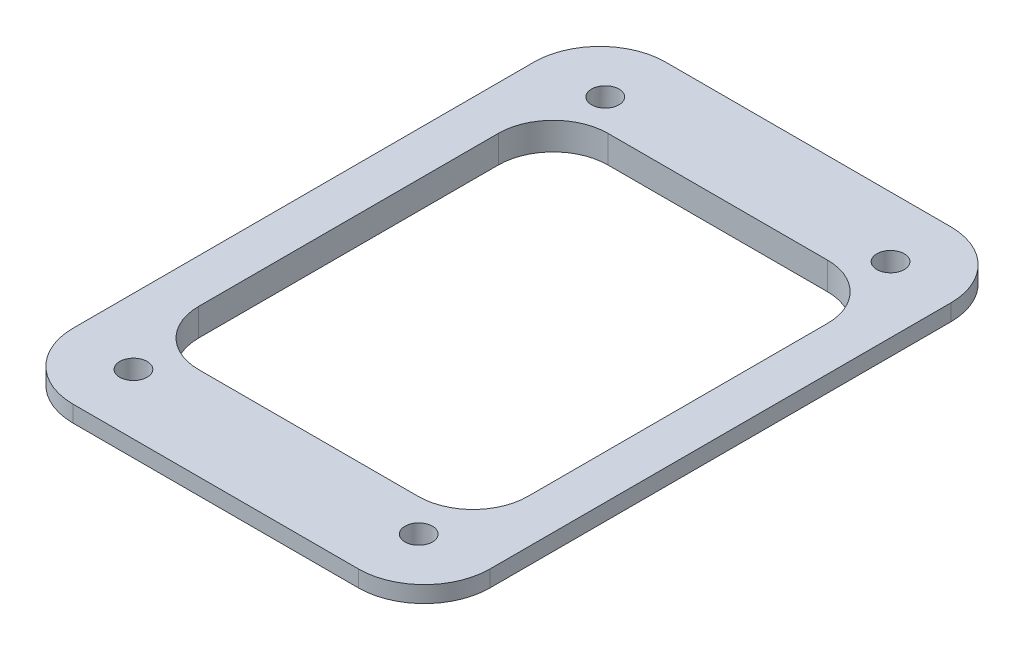
ISO-10303-21;
HEADER;
FILE_DESCRIPTION(('STEP AP214'),'2;1');
FILE_NAME('part.step','',(''),(''),'','','');
FILE_SCHEMA(('AUTOMOTIVE_DESIGN { 1 0 10303 214 1 1 1 1 }'));
ENDSEC;
DATA;
#1=APPLICATION_CONTEXT('core data for automotive mechanical design processes');
#2=APPLICATION_PROTOCOL_DEFINITION('international standard','automotive_design',2000,#1);
#3=PRODUCT_CONTEXT('',#1,'mechanical');
#4=PRODUCT('Part','Part','',(#3));
#5=PRODUCT_RELATED_PRODUCT_CATEGORY('part','',(#4));
#6=PRODUCT_DEFINITION_FORMATION('','',#4);
#7=PRODUCT_DEFINITION_CONTEXT('part definition',#1,'design');
#8=PRODUCT_DEFINITION('design','',#6,#7);
#9=PRODUCT_DEFINITION_SHAPE('','',#8);
#10=(LENGTH_UNIT() NAMED_UNIT(*) SI_UNIT(.MILLI.,.METRE.));
#11=(NAMED_UNIT(*) PLANE_ANGLE_UNIT() SI_UNIT($,.RADIAN.));
#12=(NAMED_UNIT(*) SI_UNIT($,.STERADIAN.) SOLID_ANGLE_UNIT());
#13=UNCERTAINTY_MEASURE_WITH_UNIT(LENGTH_MEASURE(1.E-05),#10,'distance_accuracy_value','');
#14=(GEOMETRIC_REPRESENTATION_CONTEXT(3) GLOBAL_UNCERTAINTY_ASSIGNED_CONTEXT((#13)) GLOBAL_UNIT_ASSIGNED_CONTEXT((#10,
#11,#12)) REPRESENTATION_CONTEXT('',''));
#15=CARTESIAN_POINT('',(0.,0.,0.));
#16=DIRECTION('',(0.,0.,1.));
#17=DIRECTION('',(1.,0.,0.));
#18=AXIS2_PLACEMENT_3D('',#15,#16,#17);
#19=CARTESIAN_POINT('',(-31.,0.,-3.));
#20=DIRECTION('',(0.,-1.,0.));
#21=DIRECTION('',(0.,0.,-1.));
#22=AXIS2_PLACEMENT_3D('',#19,#20,#21);
#23=PLANE('',#22);
#24=CARTESIAN_POINT('',(-30.,0.,-3.49999999999999));
#25=DIRECTION('',(0.,-1.,0.));
#26=DIRECTION('',(0.,0.,-1.));
#27=AXIS2_PLACEMENT_3D('',#24,#25,#26);
#28=CIRCLE('',#27,1.25);
#29=CARTESIAN_POINT('',(-30.,0.,-4.74999999999999));
#30=VERTEX_POINT('',#29);
#31=EDGE_CURVE('E249',#30,#30,#28,.T.);
#32=ORIENTED_EDGE('',*,*,#31,.F.);
#33=EDGE_LOOP('',(#32));
#34=FACE_BOUND('',#33,.T.);
#35=CARTESIAN_POINT('',(-3.99999999999999,0.,-3.5));
#36=DIRECTION('',(0.,-1.,0.));
#37=DIRECTION('',(0.,0.,-1.));
#38=AXIS2_PLACEMENT_3D('',#35,#36,#37);
#39=CIRCLE('',#38,1.25);
#40=CARTESIAN_POINT('',(-3.99999999999999,0.,-4.75));
#41=VERTEX_POINT('',#40);
#42=EDGE_CURVE('E626',#41,#41,#39,.T.);
#43=ORIENTED_EDGE('',*,*,#42,.F.);
#44=EDGE_LOOP('',(#43));
#45=FACE_BOUND('',#44,.T.);
#46=CARTESIAN_POINT('',(-4.,0.,-46.5));
#47=DIRECTION('',(0.,-1.,0.));
#48=DIRECTION('',(0.,0.,-1.));
#49=AXIS2_PLACEMENT_3D('',#46,#47,#48);
#50=CIRCLE('',#49,1.25);
#51=CARTESIAN_POINT('',(-4.,0.,-47.75));
#52=VERTEX_POINT('',#51);
#53=EDGE_CURVE('E607',#52,#52,#50,.T.);
#54=ORIENTED_EDGE('',*,*,#53,.F.);
#55=EDGE_LOOP('',(#54));
#56=FACE_BOUND('',#55,.T.);
#57=CARTESIAN_POINT('',(-30.,0.,-46.5));
#58=DIRECTION('',(0.,-1.,0.));
#59=DIRECTION('',(0.,0.,-1.));
#60=AXIS2_PLACEMENT_3D('',#57,#58,#59);
#61=CIRCLE('',#60,1.25);
#62=CARTESIAN_POINT('',(-30.,0.,-47.75));
#63=VERTEX_POINT('',#62);
#64=EDGE_CURVE('E616',#63,#63,#61,.T.);
#65=ORIENTED_EDGE('',*,*,#64,.F.);
#66=EDGE_LOOP('',(#65));
#67=FACE_BOUND('',#66,.T.);
#68=DIRECTION('',(0.,0.,-1.));
#69=VECTOR('',#68,1.);
#70=CARTESIAN_POINT('',(-27.165,0.,-45.83));
#71=LINE('',#70,#69);
#72=CARTESIAN_POINT('',(-27.165,0.,-45.83));
#73=VERTEX_POINT('',#72);
#74=CARTESIAN_POINT('',(-27.165,0.,-48.37));
#75=VERTEX_POINT('',#74);
#76=EDGE_CURVE('E52',#73,#75,#71,.T.);
#77=ORIENTED_EDGE('',*,*,#76,.F.);
#78=DIRECTION('',(-1.,0.,0.));
#79=VECTOR('',#78,1.);
#80=CARTESIAN_POINT('',(-27.165,0.,-45.83));
#81=LINE('',#80,#79);
#82=CARTESIAN_POINT('',(-6.825,0.,-45.83));
#83=VERTEX_POINT('',#82);
#84=EDGE_CURVE('E243',#83,#73,#81,.T.);
#85=ORIENTED_EDGE('',*,*,#84,.F.);
#86=DIRECTION('',(0.,0.,1.));
#87=VECTOR('',#86,1.);
#88=CARTESIAN_POINT('',(-6.825,0.,-45.83));
#89=LINE('',#88,#87);
#90=CARTESIAN_POINT('',(-6.825,0.,-48.37));
#91=VERTEX_POINT('',#90);
#92=EDGE_CURVE('E246',#91,#83,#89,.T.);
#93=ORIENTED_EDGE('',*,*,#92,.F.);
#94=DIRECTION('',(1.,0.,0.));
#95=VECTOR('',#94,1.);
#96=CARTESIAN_POINT('',(-27.165,0.,-48.37));
#97=LINE('',#96,#95);
#98=EDGE_CURVE('E255',#75,#91,#97,.T.);
#99=ORIENTED_EDGE('',*,*,#98,.F.);
#100=EDGE_LOOP('',(#77,#85,#93,#99));
#101=FACE_BOUND('',#100,.T.);
#102=CARTESIAN_POINT('',(-31.,0.,-3.));
#103=DIRECTION('',(0.,1.,0.));
#104=DIRECTION('',(0.,0.,-1.));
#105=AXIS2_PLACEMENT_3D('',#102,#103,#104);
#106=CIRCLE('',#105,3.);
#107=CARTESIAN_POINT('',(-34.,0.,-3.));
#108=VERTEX_POINT('',#107);
#109=CARTESIAN_POINT('',(-31.,0.,0.));
#110=VERTEX_POINT('',#109);
#111=EDGE_CURVE('E384',#108,#110,#106,.T.);
#112=ORIENTED_EDGE('',*,*,#111,.F.);
#113=DIRECTION('',(0.,0.,1.));
#114=VECTOR('',#113,1.);
#115=CARTESIAN_POINT('',(-34.,0.,-3.));
#116=LINE('',#115,#114);
#117=CARTESIAN_POINT('',(-34.,0.,-47.));
#118=VERTEX_POINT('',#117);
#119=EDGE_CURVE('E389',#118,#108,#116,.T.);
#120=ORIENTED_EDGE('',*,*,#119,.F.);
#121=CARTESIAN_POINT('',(-31.,0.,-47.));
#122=DIRECTION('',(0.,1.,0.));
#123=DIRECTION('',(0.,0.,1.));
#124=AXIS2_PLACEMENT_3D('',#121,#122,#123);
#125=CIRCLE('',#124,3.);
#126=CARTESIAN_POINT('',(-31.,0.,-50.));
#127=VERTEX_POINT('',#126);
#128=EDGE_CURVE('E423',#127,#118,#125,.T.);
#129=ORIENTED_EDGE('',*,*,#128,.F.);
#130=DIRECTION('',(-1.,0.,0.));
#131=VECTOR('',#130,1.);
#132=CARTESIAN_POINT('',(-3.,0.,-50.));
#133=LINE('',#132,#131);
#134=CARTESIAN_POINT('',(-3.,0.,-50.));
#135=VERTEX_POINT('',#134);
#136=EDGE_CURVE('E421',#135,#127,#133,.T.);
#137=ORIENTED_EDGE('',*,*,#136,.F.);
#138=CARTESIAN_POINT('',(-3.,0.,-47.));
#139=DIRECTION('',(0.,1.,0.));
#140=DIRECTION('',(0.,0.,1.));
#141=AXIS2_PLACEMENT_3D('',#138,#139,#140);
#142=CIRCLE('',#141,3.);
#143=CARTESIAN_POINT('',(0.,0.,-47.));
#144=VERTEX_POINT('',#143);
#145=EDGE_CURVE('E419',#144,#135,#142,.T.);
#146=ORIENTED_EDGE('',*,*,#145,.F.);
#147=DIRECTION('',(0.,0.,-1.));
#148=VECTOR('',#147,1.);
#149=CARTESIAN_POINT('',(0.,0.,-3.));
#150=LINE('',#149,#148);
#151=CARTESIAN_POINT('',(0.,0.,-3.));
#152=VERTEX_POINT('',#151);
#153=EDGE_CURVE('E417',#152,#144,#150,.T.);
#154=ORIENTED_EDGE('',*,*,#153,.F.);
#155=CARTESIAN_POINT('',(-3.,0.,-3.));
#156=DIRECTION('',(0.,1.,0.));
#157=DIRECTION('',(0.,0.,-1.));
#158=AXIS2_PLACEMENT_3D('',#155,#156,#157);
#159=CIRCLE('',#158,3.);
#160=CARTESIAN_POINT('',(-3.,0.,0.));
#161=VERTEX_POINT('',#160);
#162=EDGE_CURVE('E415',#161,#152,#159,.T.);
#163=ORIENTED_EDGE('',*,*,#162,.F.);
#164=DIRECTION('',(1.,0.,0.));
#165=VECTOR('',#164,1.);
#166=CARTESIAN_POINT('',(-3.,0.,0.));
#167=LINE('',#166,#165);
#168=EDGE_CURVE('E413',#110,#161,#167,.T.);
#169=ORIENTED_EDGE('',*,*,#168,.F.);
#170=EDGE_LOOP('',(#112,#120,#129,#137,#146,#154,#163,#169));
#171=FACE_BOUND('',#170,.T.);
#172=DIRECTION('',(0.,0.,1.));
#173=VECTOR('',#172,1.);
#174=CARTESIAN_POINT('',(-32.,0.,-38.75));
#175=LINE('',#174,#173);
#176=CARTESIAN_POINT('',(-32.,0.,-38.75));
#177=VERTEX_POINT('',#176);
#178=CARTESIAN_POINT('',(-32.,0.,-11.45));
#179=VERTEX_POINT('',#178);
#180=EDGE_CURVE('E365',#177,#179,#175,.T.);
#181=ORIENTED_EDGE('',*,*,#180,.T.);
#182=CARTESIAN_POINT('',(-27.,0.,-11.45));
#183=DIRECTION('',(0.,1.,0.));
#184=DIRECTION('',(0.,0.,-1.));
#185=AXIS2_PLACEMENT_3D('',#182,#183,#184);
#186=CIRCLE('',#185,5.);
#187=CARTESIAN_POINT('',(-27.,0.,-6.45));
#188=VERTEX_POINT('',#187);
#189=EDGE_CURVE('E60',#179,#188,#186,.T.);
#190=ORIENTED_EDGE('',*,*,#189,.T.);
#191=DIRECTION('',(1.,0.,0.));
#192=VECTOR('',#191,1.);
#193=CARTESIAN_POINT('',(-27.,0.,-6.45));
#194=LINE('',#193,#192);
#195=CARTESIAN_POINT('',(-7.,0.,-6.45));
#196=VERTEX_POINT('',#195);
#197=EDGE_CURVE('E347',#188,#196,#194,.T.);
#198=ORIENTED_EDGE('',*,*,#197,.T.);
#199=CARTESIAN_POINT('',(-7.,0.,-11.45));
#200=DIRECTION('',(0.,1.,0.));
#201=DIRECTION('',(0.,0.,1.));
#202=AXIS2_PLACEMENT_3D('',#199,#200,#201);
#203=CIRCLE('',#202,5.);
#204=CARTESIAN_POINT('',(-2.,0.,-11.45));
#205=VERTEX_POINT('',#204);
#206=EDGE_CURVE('E350',#196,#205,#203,.T.);
#207=ORIENTED_EDGE('',*,*,#206,.T.);
#208=DIRECTION('',(0.,0.,-1.));
#209=VECTOR('',#208,1.);
#210=CARTESIAN_POINT('',(-2.,0.,-38.75));
#211=LINE('',#210,#209);
#212=CARTESIAN_POINT('',(-2.,0.,-38.75));
#213=VERTEX_POINT('',#212);
#214=EDGE_CURVE('E353',#205,#213,#211,.T.);
#215=ORIENTED_EDGE('',*,*,#214,.T.);
#216=CARTESIAN_POINT('',(-7.,0.,-38.75));
#217=DIRECTION('',(0.,1.,0.));
#218=DIRECTION('',(0.,0.,1.));
#219=AXIS2_PLACEMENT_3D('',#216,#217,#218);
#220=CIRCLE('',#219,5.);
#221=CARTESIAN_POINT('',(-7.,0.,-43.75));
#222=VERTEX_POINT('',#221);
#223=EDGE_CURVE('E356',#213,#222,#220,.T.);
#224=ORIENTED_EDGE('',*,*,#223,.T.);
#225=DIRECTION('',(-1.,0.,0.));
#226=VECTOR('',#225,1.);
#227=CARTESIAN_POINT('',(-27.,0.,-43.75));
#228=LINE('',#227,#226);
#229=CARTESIAN_POINT('',(-27.,0.,-43.75));
#230=VERTEX_POINT('',#229);
#231=EDGE_CURVE('E359',#222,#230,#228,.T.);
#232=ORIENTED_EDGE('',*,*,#231,.T.);
#233=CARTESIAN_POINT('',(-27.,0.,-38.75));
#234=DIRECTION('',(0.,1.,0.));
#235=DIRECTION('',(0.,0.,1.));
#236=AXIS2_PLACEMENT_3D('',#233,#234,#235);
#237=CIRCLE('',#236,5.);
#238=EDGE_CURVE('E362',#230,#177,#237,.T.);
#239=ORIENTED_EDGE('',*,*,#238,.T.);
#240=EDGE_LOOP('',(#181,#190,#198,#207,#215,#224,#232,#239));
#241=FACE_BOUND('',#240,.T.);
#242=ADVANCED_FACE('F37',(#34,#45,#56,#67,#101,#171,#241),#23,.T.);
#243=CARTESIAN_POINT('',(-31.,1.,-3.));
#244=DIRECTION('',(0.,-1.,0.));
#245=DIRECTION('',(0.,0.,-1.));
#246=AXIS2_PLACEMENT_3D('',#243,#244,#245);
#247=CYLINDRICAL_SURFACE('',#246,3.);
#248=ORIENTED_EDGE('',*,*,#111,.T.);
#249=DIRECTION('',(0.,-1.,0.));
#250=VECTOR('',#249,1.);
#251=CARTESIAN_POINT('',(-31.,1.,0.));
#252=LINE('',#251,#250);
#253=CARTESIAN_POINT('',(-31.,1.,0.));
#254=VERTEX_POINT('',#253);
#255=EDGE_CURVE('E11',#254,#110,#252,.T.);
#256=ORIENTED_EDGE('',*,*,#255,.F.);
#257=CARTESIAN_POINT('',(-31.,1.,-3.));
#258=DIRECTION('',(0.,1.,0.));
#259=DIRECTION('',(0.,0.,-1.));
#260=AXIS2_PLACEMENT_3D('',#257,#258,#259);
#261=CIRCLE('',#260,3.);
#262=CARTESIAN_POINT('',(-34.,1.,-3.));
#263=VERTEX_POINT('',#262);
#264=EDGE_CURVE('E385',#263,#254,#261,.T.);
#265=ORIENTED_EDGE('',*,*,#264,.F.);
#266=DIRECTION('',(0.,-1.,0.));
#267=VECTOR('',#266,1.);
#268=CARTESIAN_POINT('',(-34.,1.,-3.));
#269=LINE('',#268,#267);
#270=EDGE_CURVE('E410',#263,#108,#269,.T.);
#271=ORIENTED_EDGE('',*,*,#270,.T.);
#272=EDGE_LOOP('',(#248,#256,#265,#271));
#273=FACE_BOUND('',#272,.T.);
#274=ADVANCED_FACE('F39',(#273),#247,.T.);
#275=CARTESIAN_POINT('',(-3.,1.,0.));
#276=DIRECTION('',(0.,0.,-1.));
#277=DIRECTION('',(-1.,0.,0.));
#278=AXIS2_PLACEMENT_3D('',#275,#276,#277);
#279=PLANE('',#278);
#280=ORIENTED_EDGE('',*,*,#168,.T.);
#281=DIRECTION('',(0.,-1.,0.));
#282=VECTOR('',#281,1.);
#283=CARTESIAN_POINT('',(-3.,1.,0.));
#284=LINE('',#283,#282);
#285=CARTESIAN_POINT('',(-3.,1.,0.));
#286=VERTEX_POINT('',#285);
#287=EDGE_CURVE('E45',#286,#161,#284,.T.);
#288=ORIENTED_EDGE('',*,*,#287,.F.);
#289=DIRECTION('',(1.,0.,0.));
#290=VECTOR('',#289,1.);
#291=CARTESIAN_POINT('',(-3.,1.,0.));
#292=LINE('',#291,#290);
#293=EDGE_CURVE('E388',#254,#286,#292,.T.);
#294=ORIENTED_EDGE('',*,*,#293,.F.);
#295=ORIENTED_EDGE('',*,*,#255,.T.);
#296=EDGE_LOOP('',(#280,#288,#294,#295));
#297=FACE_BOUND('',#296,.T.);
#298=ADVANCED_FACE('F465',(#297),#279,.F.);
#299=CARTESIAN_POINT('',(-3.,1.,-3.));
#300=DIRECTION('',(0.,-1.,0.));
#301=DIRECTION('',(0.,0.,-1.));
#302=AXIS2_PLACEMENT_3D('',#299,#300,#301);
#303=CYLINDRICAL_SURFACE('',#302,3.);
#304=ORIENTED_EDGE('',*,*,#162,.T.);
#305=DIRECTION('',(0.,-1.,0.));
#306=VECTOR('',#305,1.);
#307=CARTESIAN_POINT('',(0.,1.,-3.));
#308=LINE('',#307,#306);
#309=CARTESIAN_POINT('',(0.,1.,-3.));
#310=VERTEX_POINT('',#309);
#311=EDGE_CURVE('E440',#310,#152,#308,.T.);
#312=ORIENTED_EDGE('',*,*,#311,.F.);
#313=CARTESIAN_POINT('',(-3.,1.,-3.));
#314=DIRECTION('',(0.,1.,0.));
#315=DIRECTION('',(0.,0.,-1.));
#316=AXIS2_PLACEMENT_3D('',#313,#314,#315);
#317=CIRCLE('',#316,3.);
#318=EDGE_CURVE('E392',#286,#310,#317,.T.);
#319=ORIENTED_EDGE('',*,*,#318,.F.);
#320=ORIENTED_EDGE('',*,*,#287,.T.);
#321=EDGE_LOOP('',(#304,#312,#319,#320));
#322=FACE_BOUND('',#321,.T.);
#323=ADVANCED_FACE('F446',(#322),#303,.T.);
#324=CARTESIAN_POINT('',(0.,1.,-3.));
#325=DIRECTION('',(-1.,0.,0.));
#326=DIRECTION('',(0.,0.,1.));
#327=AXIS2_PLACEMENT_3D('',#324,#325,#326);
#328=PLANE('',#327);
#329=ORIENTED_EDGE('',*,*,#153,.T.);
#330=DIRECTION('',(0.,-1.,0.));
#331=VECTOR('',#330,1.);
#332=CARTESIAN_POINT('',(0.,1.,-47.));
#333=LINE('',#332,#331);
#334=CARTESIAN_POINT('',(0.,1.,-47.));
#335=VERTEX_POINT('',#334);
#336=EDGE_CURVE('E437',#335,#144,#333,.T.);
#337=ORIENTED_EDGE('',*,*,#336,.F.);
#338=DIRECTION('',(0.,0.,-1.));
#339=VECTOR('',#338,1.);
#340=CARTESIAN_POINT('',(0.,1.,-3.));
#341=LINE('',#340,#339);
#342=EDGE_CURVE('E395',#310,#335,#341,.T.);
#343=ORIENTED_EDGE('',*,*,#342,.F.);
#344=ORIENTED_EDGE('',*,*,#311,.T.);
#345=EDGE_LOOP('',(#329,#337,#343,#344));
#346=FACE_BOUND('',#345,.T.);
#347=ADVANCED_FACE('F455',(#346),#328,.F.);
#348=CARTESIAN_POINT('',(-3.,1.,-47.));
#349=DIRECTION('',(0.,-1.,0.));
#350=DIRECTION('',(0.,0.,-1.));
#351=AXIS2_PLACEMENT_3D('',#348,#349,#350);
#352=CYLINDRICAL_SURFACE('',#351,3.);
#353=ORIENTED_EDGE('',*,*,#145,.T.);
#354=DIRECTION('',(0.,-1.,0.));
#355=VECTOR('',#354,1.);
#356=CARTESIAN_POINT('',(-3.,1.,-50.));
#357=LINE('',#356,#355);
#358=CARTESIAN_POINT('',(-3.,1.,-50.));
#359=VERTEX_POINT('',#358);
#360=EDGE_CURVE('E434',#359,#135,#357,.T.);
#361=ORIENTED_EDGE('',*,*,#360,.F.);
#362=CARTESIAN_POINT('',(-3.,1.,-47.));
#363=DIRECTION('',(0.,1.,0.));
#364=DIRECTION('',(0.,0.,1.));
#365=AXIS2_PLACEMENT_3D('',#362,#363,#364);
#366=CIRCLE('',#365,3.);
#367=EDGE_CURVE('E398',#335,#359,#366,.T.);
#368=ORIENTED_EDGE('',*,*,#367,.F.);
#369=ORIENTED_EDGE('',*,*,#336,.T.);
#370=EDGE_LOOP('',(#353,#361,#368,#369));
#371=FACE_BOUND('',#370,.T.);
#372=ADVANCED_FACE('F459',(#371),#352,.T.);
#373=CARTESIAN_POINT('',(-3.,1.,-50.));
#374=DIRECTION('',(0.,0.,1.));
#375=DIRECTION('',(1.,0.,0.));
#376=AXIS2_PLACEMENT_3D('',#373,#374,#375);
#377=PLANE('',#376);
#378=ORIENTED_EDGE('',*,*,#136,.T.);
#379=DIRECTION('',(0.,-1.,0.));
#380=VECTOR('',#379,1.);
#381=CARTESIAN_POINT('',(-31.,1.,-50.));
#382=LINE('',#381,#380);
#383=CARTESIAN_POINT('',(-31.,1.,-50.));
#384=VERTEX_POINT('',#383);
#385=EDGE_CURVE('E431',#384,#127,#382,.T.);
#386=ORIENTED_EDGE('',*,*,#385,.F.);
#387=DIRECTION('',(-1.,0.,0.));
#388=VECTOR('',#387,1.);
#389=CARTESIAN_POINT('',(-3.,1.,-50.));
#390=LINE('',#389,#388);
#391=EDGE_CURVE('E401',#359,#384,#390,.T.);
#392=ORIENTED_EDGE('',*,*,#391,.F.);
#393=ORIENTED_EDGE('',*,*,#360,.T.);
#394=EDGE_LOOP('',(#378,#386,#392,#393));
#395=FACE_BOUND('',#394,.T.);
#396=ADVANCED_FACE('F477',(#395),#377,.F.);
#397=CARTESIAN_POINT('',(-31.,1.,-47.));
#398=DIRECTION('',(0.,-1.,0.));
#399=DIRECTION('',(0.,0.,-1.));
#400=AXIS2_PLACEMENT_3D('',#397,#398,#399);
#401=CYLINDRICAL_SURFACE('',#400,3.);
#402=ORIENTED_EDGE('',*,*,#128,.T.);
#403=DIRECTION('',(0.,-1.,0.));
#404=VECTOR('',#403,1.);
#405=CARTESIAN_POINT('',(-34.,1.,-47.));
#406=LINE('',#405,#404);
#407=CARTESIAN_POINT('',(-34.,1.,-47.));
#408=VERTEX_POINT('',#407);
#409=EDGE_CURVE('E428',#408,#118,#406,.T.);
#410=ORIENTED_EDGE('',*,*,#409,.F.);
#411=CARTESIAN_POINT('',(-31.,1.,-47.));
#412=DIRECTION('',(0.,1.,0.));
#413=DIRECTION('',(0.,0.,1.));
#414=AXIS2_PLACEMENT_3D('',#411,#412,#413);
#415=CIRCLE('',#414,3.);
#416=EDGE_CURVE('E404',#384,#408,#415,.T.);
#417=ORIENTED_EDGE('',*,*,#416,.F.);
#418=ORIENTED_EDGE('',*,*,#385,.T.);
#419=EDGE_LOOP('',(#402,#410,#417,#418));
#420=FACE_BOUND('',#419,.T.);
#421=ADVANCED_FACE('F475',(#420),#401,.T.);
#422=CARTESIAN_POINT('',(-34.,1.,-3.));
#423=DIRECTION('',(1.,0.,0.));
#424=DIRECTION('',(0.,0.,-1.));
#425=AXIS2_PLACEMENT_3D('',#422,#423,#424);
#426=PLANE('',#425);
#427=ORIENTED_EDGE('',*,*,#119,.T.);
#428=ORIENTED_EDGE('',*,*,#270,.F.);
#429=DIRECTION('',(0.,0.,1.));
#430=VECTOR('',#429,1.);
#431=CARTESIAN_POINT('',(-34.,1.,-3.));
#432=LINE('',#431,#430);
#433=EDGE_CURVE('E407',#408,#263,#432,.T.);
#434=ORIENTED_EDGE('',*,*,#433,.F.);
#435=ORIENTED_EDGE('',*,*,#409,.T.);
#436=EDGE_LOOP('',(#427,#428,#434,#435));
#437=FACE_BOUND('',#436,.T.);
#438=ADVANCED_FACE('F471',(#437),#426,.F.);
#439=CARTESIAN_POINT('',(-27.,1.,-11.45));
#440=DIRECTION('',(0.,-1.,0.));
#441=DIRECTION('',(0.,0.,-1.));
#442=AXIS2_PLACEMENT_3D('',#439,#440,#441);
#443=CYLINDRICAL_SURFACE('',#442,5.);
#444=ORIENTED_EDGE('',*,*,#189,.F.);
#445=DIRECTION('',(0.,-1.,0.));
#446=VECTOR('',#445,1.);
#447=CARTESIAN_POINT('',(-32.,1.,-11.45));
#448=LINE('',#447,#446);
#449=CARTESIAN_POINT('',(-32.,2.5,-11.45));
#450=VERTEX_POINT('',#449);
#451=EDGE_CURVE('E368',#450,#179,#448,.T.);
#452=ORIENTED_EDGE('',*,*,#451,.F.);
#453=CARTESIAN_POINT('',(-27.,2.5,-11.45));
#454=DIRECTION('',(0.,1.,0.));
#455=DIRECTION('',(0.,0.,-1.));
#456=AXIS2_PLACEMENT_3D('',#453,#454,#455);
#457=CIRCLE('',#456,5.);
#458=CARTESIAN_POINT('',(-27.,2.5,-6.45));
#459=VERTEX_POINT('',#458);
#460=EDGE_CURVE('E261',#450,#459,#457,.T.);
#461=ORIENTED_EDGE('',*,*,#460,.T.);
#462=DIRECTION('',(0.,-1.,0.));
#463=VECTOR('',#462,1.);
#464=CARTESIAN_POINT('',(-27.,1.,-6.45));
#465=LINE('',#464,#463);
#466=EDGE_CURVE('E382',#459,#188,#465,.T.);
#467=ORIENTED_EDGE('',*,*,#466,.T.);
#468=EDGE_LOOP('',(#444,#452,#461,#467));
#469=FACE_BOUND('',#468,.T.);
#470=ADVANCED_FACE('F498',(#469),#443,.F.);
#471=CARTESIAN_POINT('',(-27.,1.,-6.45));
#472=DIRECTION('',(0.,0.,-1.));
#473=DIRECTION('',(-1.,0.,0.));
#474=AXIS2_PLACEMENT_3D('',#471,#472,#473);
#475=PLANE('',#474);
#476=ORIENTED_EDGE('',*,*,#197,.F.);
#477=ORIENTED_EDGE('',*,*,#466,.F.);
#478=DIRECTION('',(1.,0.,0.));
#479=VECTOR('',#478,1.);
#480=CARTESIAN_POINT('',(-27.,2.5,-6.45));
#481=LINE('',#480,#479);
#482=CARTESIAN_POINT('',(-7.00000000000003,2.5,-6.45));
#483=VERTEX_POINT('',#482);
#484=EDGE_CURVE('E267',#459,#483,#481,.T.);
#485=ORIENTED_EDGE('',*,*,#484,.T.);
#486=DIRECTION('',(0.,-1.,0.));
#487=VECTOR('',#486,1.);
#488=CARTESIAN_POINT('',(-7.,1.,-6.45));
#489=LINE('',#488,#487);
#490=EDGE_CURVE('E380',#483,#196,#489,.T.);
#491=ORIENTED_EDGE('',*,*,#490,.T.);
#492=EDGE_LOOP('',(#476,#477,#485,#491));
#493=FACE_BOUND('',#492,.T.);
#494=ADVANCED_FACE('F504',(#493),#475,.T.);
#495=CARTESIAN_POINT('',(-7.,1.,-11.45));
#496=DIRECTION('',(0.,-1.,0.));
#497=DIRECTION('',(0.,0.,-1.));
#498=AXIS2_PLACEMENT_3D('',#495,#496,#497);
#499=CYLINDRICAL_SURFACE('',#498,5.);
#500=ORIENTED_EDGE('',*,*,#206,.F.);
#501=ORIENTED_EDGE('',*,*,#490,.F.);
#502=CARTESIAN_POINT('',(-6.99999999999999,2.5,-11.45));
#503=DIRECTION('',(0.,1.,0.));
#504=DIRECTION('',(0.,0.,-1.));
#505=AXIS2_PLACEMENT_3D('',#502,#503,#504);
#506=CIRCLE('',#505,5.);
#507=CARTESIAN_POINT('',(-1.99999999999999,2.5,-11.45));
#508=VERTEX_POINT('',#507);
#509=EDGE_CURVE('E270',#483,#508,#506,.T.);
#510=ORIENTED_EDGE('',*,*,#509,.T.);
#511=DIRECTION('',(0.,-1.,0.));
#512=VECTOR('',#511,1.);
#513=CARTESIAN_POINT('',(-2.,1.,-11.45));
#514=LINE('',#513,#512);
#515=EDGE_CURVE('E378',#508,#205,#514,.T.);
#516=ORIENTED_EDGE('',*,*,#515,.T.);
#517=EDGE_LOOP('',(#500,#501,#510,#516));
#518=FACE_BOUND('',#517,.T.);
#519=ADVANCED_FACE('F508',(#518),#499,.F.);
#520=CARTESIAN_POINT('',(-2.,1.,-38.75));
#521=DIRECTION('',(-1.,0.,0.));
#522=DIRECTION('',(0.,0.,1.));
#523=AXIS2_PLACEMENT_3D('',#520,#521,#522);
#524=PLANE('',#523);
#525=ORIENTED_EDGE('',*,*,#214,.F.);
#526=ORIENTED_EDGE('',*,*,#515,.F.);
#527=DIRECTION('',(0.,0.,-1.));
#528=VECTOR('',#527,1.);
#529=CARTESIAN_POINT('',(-1.99999999999999,2.5,-11.45));
#530=LINE('',#529,#528);
#531=CARTESIAN_POINT('',(-1.99999999999999,2.5,-38.75));
#532=VERTEX_POINT('',#531);
#533=EDGE_CURVE('E273',#508,#532,#530,.T.);
#534=ORIENTED_EDGE('',*,*,#533,.T.);
#535=DIRECTION('',(0.,-1.,0.));
#536=VECTOR('',#535,1.);
#537=CARTESIAN_POINT('',(-2.,1.,-38.75));
#538=LINE('',#537,#536);
#539=EDGE_CURVE('E376',#532,#213,#538,.T.);
#540=ORIENTED_EDGE('',*,*,#539,.T.);
#541=EDGE_LOOP('',(#525,#526,#534,#540));
#542=FACE_BOUND('',#541,.T.);
#543=ADVANCED_FACE('F513',(#542),#524,.T.);
#544=CARTESIAN_POINT('',(-7.,1.,-38.75));
#545=DIRECTION('',(0.,-1.,0.));
#546=DIRECTION('',(0.,0.,-1.));
#547=AXIS2_PLACEMENT_3D('',#544,#545,#546);
#548=CYLINDRICAL_SURFACE('',#547,5.);
#549=ORIENTED_EDGE('',*,*,#223,.F.);
#550=ORIENTED_EDGE('',*,*,#539,.F.);
#551=CARTESIAN_POINT('',(-6.99999999999999,2.5,-38.75));
#552=DIRECTION('',(0.,1.,0.));
#553=DIRECTION('',(0.,0.,1.));
#554=AXIS2_PLACEMENT_3D('',#551,#552,#553);
#555=CIRCLE('',#554,5.);
#556=CARTESIAN_POINT('',(-7.00000000000003,2.5,-43.75));
#557=VERTEX_POINT('',#556);
#558=EDGE_CURVE('E276',#532,#557,#555,.T.);
#559=ORIENTED_EDGE('',*,*,#558,.T.);
#560=DIRECTION('',(0.,-1.,0.));
#561=VECTOR('',#560,1.);
#562=CARTESIAN_POINT('',(-7.,1.,-43.75));
#563=LINE('',#562,#561);
#564=EDGE_CURVE('E374',#557,#222,#563,.T.);
#565=ORIENTED_EDGE('',*,*,#564,.T.);
#566=EDGE_LOOP('',(#549,#550,#559,#565));
#567=FACE_BOUND('',#566,.T.);
#568=ADVANCED_FACE('F519',(#567),#548,.F.);
#569=CARTESIAN_POINT('',(-27.,1.,-43.75));
#570=DIRECTION('',(0.,0.,1.));
#571=DIRECTION('',(1.,0.,0.));
#572=AXIS2_PLACEMENT_3D('',#569,#570,#571);
#573=PLANE('',#572);
#574=ORIENTED_EDGE('',*,*,#231,.F.);
#575=ORIENTED_EDGE('',*,*,#564,.F.);
#576=DIRECTION('',(-1.,0.,0.));
#577=VECTOR('',#576,1.);
#578=CARTESIAN_POINT('',(-7.00000000000003,2.5,-43.75));
#579=LINE('',#578,#577);
#580=CARTESIAN_POINT('',(-27.,2.5,-43.75));
#581=VERTEX_POINT('',#580);
#582=EDGE_CURVE('E279',#557,#581,#579,.T.);
#583=ORIENTED_EDGE('',*,*,#582,.T.);
#584=DIRECTION('',(0.,-1.,0.));
#585=VECTOR('',#584,1.);
#586=CARTESIAN_POINT('',(-27.,1.,-43.75));
#587=LINE('',#586,#585);
#588=EDGE_CURVE('E372',#581,#230,#587,.T.);
#589=ORIENTED_EDGE('',*,*,#588,.T.);
#590=EDGE_LOOP('',(#574,#575,#583,#589));
#591=FACE_BOUND('',#590,.T.);
#592=ADVANCED_FACE('F523',(#591),#573,.T.);
#593=CARTESIAN_POINT('',(-27.,1.,-38.75));
#594=DIRECTION('',(0.,-1.,0.));
#595=DIRECTION('',(0.,0.,-1.));
#596=AXIS2_PLACEMENT_3D('',#593,#594,#595);
#597=CYLINDRICAL_SURFACE('',#596,5.);
#598=ORIENTED_EDGE('',*,*,#238,.F.);
#599=ORIENTED_EDGE('',*,*,#588,.F.);
#600=CARTESIAN_POINT('',(-27.,2.5,-38.75));
#601=DIRECTION('',(0.,1.,0.));
#602=DIRECTION('',(0.,0.,1.));
#603=AXIS2_PLACEMENT_3D('',#600,#601,#602);
#604=CIRCLE('',#603,5.);
#605=CARTESIAN_POINT('',(-32.,2.5,-38.75));
#606=VERTEX_POINT('',#605);
#607=EDGE_CURVE('E282',#581,#606,#604,.T.);
#608=ORIENTED_EDGE('',*,*,#607,.T.);
#609=DIRECTION('',(0.,-1.,0.));
#610=VECTOR('',#609,1.);
#611=CARTESIAN_POINT('',(-32.,1.,-38.75));
#612=LINE('',#611,#610);
#613=EDGE_CURVE('E370',#606,#177,#612,.T.);
#614=ORIENTED_EDGE('',*,*,#613,.T.);
#615=EDGE_LOOP('',(#598,#599,#608,#614));
#616=FACE_BOUND('',#615,.T.);
#617=ADVANCED_FACE('F527',(#616),#597,.F.);
#618=CARTESIAN_POINT('',(-32.,1.,-38.75));
#619=DIRECTION('',(1.,0.,0.));
#620=DIRECTION('',(0.,0.,-1.));
#621=AXIS2_PLACEMENT_3D('',#618,#619,#620);
#622=PLANE('',#621);
#623=ORIENTED_EDGE('',*,*,#180,.F.);
#624=ORIENTED_EDGE('',*,*,#613,.F.);
#625=DIRECTION('',(0.,0.,1.));
#626=VECTOR('',#625,1.);
#627=CARTESIAN_POINT('',(-32.,2.5,-38.75));
#628=LINE('',#627,#626);
#629=EDGE_CURVE('E285',#606,#450,#628,.T.);
#630=ORIENTED_EDGE('',*,*,#629,.T.);
#631=ORIENTED_EDGE('',*,*,#451,.T.);
#632=EDGE_LOOP('',(#623,#624,#630,#631));
#633=FACE_BOUND('',#632,.T.);
#634=ADVANCED_FACE('F531',(#633),#622,.T.);
#635=CARTESIAN_POINT('',(-30.,2.5,-4.));
#636=DIRECTION('',(0.,-1.,0.));
#637=DIRECTION('',(0.,0.,-1.));
#638=AXIS2_PLACEMENT_3D('',#635,#636,#637);
#639=PLANE('',#638);
#640=CARTESIAN_POINT('',(-30.,2.5,-3.49999999999999));
#641=DIRECTION('',(0.,1.,0.));
#642=DIRECTION('',(0.,0.,1.));
#643=AXIS2_PLACEMENT_3D('',#640,#641,#642);
#644=CIRCLE('',#643,1.25);
#645=CARTESIAN_POINT('',(-30.,2.5,-2.24999999999999));
#646=VERTEX_POINT('',#645);
#647=EDGE_CURVE('E619',#646,#646,#644,.T.);
#648=ORIENTED_EDGE('',*,*,#647,.F.);
#649=EDGE_LOOP('',(#648));
#650=FACE_BOUND('',#649,.T.);
#651=CARTESIAN_POINT('',(-3.99999999999999,2.5,-3.5));
#652=DIRECTION('',(0.,1.,0.));
#653=DIRECTION('',(0.,0.,1.));
#654=AXIS2_PLACEMENT_3D('',#651,#652,#653);
#655=CIRCLE('',#654,1.25);
#656=CARTESIAN_POINT('',(-3.99999999999999,2.5,-2.25));
#657=VERTEX_POINT('',#656);
#658=EDGE_CURVE('E613',#657,#657,#655,.T.);
#659=ORIENTED_EDGE('',*,*,#658,.F.);
#660=EDGE_LOOP('',(#659));
#661=FACE_BOUND('',#660,.T.);
#662=CARTESIAN_POINT('',(-4.,2.5,-46.5));
#663=DIRECTION('',(0.,1.,0.));
#664=DIRECTION('',(0.,0.,1.));
#665=AXIS2_PLACEMENT_3D('',#662,#663,#664);
#666=CIRCLE('',#665,1.25);
#667=CARTESIAN_POINT('',(-4.,2.5,-45.25));
#668=VERTEX_POINT('',#667);
#669=EDGE_CURVE('E610',#668,#668,#666,.T.);
#670=ORIENTED_EDGE('',*,*,#669,.F.);
#671=EDGE_LOOP('',(#670));
#672=FACE_BOUND('',#671,.T.);
#673=CARTESIAN_POINT('',(-30.,2.5,-46.5));
#674=DIRECTION('',(0.,1.,0.));
#675=DIRECTION('',(0.,0.,1.));
#676=AXIS2_PLACEMENT_3D('',#673,#674,#675);
#677=CIRCLE('',#676,1.25);
#678=CARTESIAN_POINT('',(-30.,2.5,-45.25));
#679=VERTEX_POINT('',#678);
#680=EDGE_CURVE('E612',#679,#679,#677,.T.);
#681=ORIENTED_EDGE('',*,*,#680,.F.);
#682=EDGE_LOOP('',(#681));
#683=FACE_BOUND('',#682,.T.);
#684=CARTESIAN_POINT('',(-30.,2.5,-4.));
#685=DIRECTION('',(0.,1.,0.));
#686=DIRECTION('',(0.,0.,-1.));
#687=AXIS2_PLACEMENT_3D('',#684,#685,#686);
#688=CIRCLE('',#687,6.);
#689=CARTESIAN_POINT('',(-36.,2.5,-3.99999999999999));
#690=VERTEX_POINT('',#689);
#691=CARTESIAN_POINT('',(-30.,2.5,2.));
#692=VERTEX_POINT('',#691);
#693=EDGE_CURVE('E289',#690,#692,#688,.T.);
#694=ORIENTED_EDGE('',*,*,#693,.T.);
#695=DIRECTION('',(1.,0.,0.));
#696=VECTOR('',#695,1.);
#697=CARTESIAN_POINT('',(-30.,2.5,2.));
#698=LINE('',#697,#696);
#699=CARTESIAN_POINT('',(-3.99999999999999,2.5,2.));
#700=VERTEX_POINT('',#699);
#701=EDGE_CURVE('E292',#692,#700,#698,.T.);
#702=ORIENTED_EDGE('',*,*,#701,.T.);
#703=CARTESIAN_POINT('',(-3.99999999999999,2.5,-4.));
#704=DIRECTION('',(0.,1.,0.));
#705=DIRECTION('',(0.,0.,-1.));
#706=AXIS2_PLACEMENT_3D('',#703,#704,#705);
#707=CIRCLE('',#706,6.);
#708=CARTESIAN_POINT('',(2.00000000000001,2.5,-4.));
#709=VERTEX_POINT('',#708);
#710=EDGE_CURVE('E295',#700,#709,#707,.T.);
#711=ORIENTED_EDGE('',*,*,#710,.T.);
#712=DIRECTION('',(0.,0.,-1.));
#713=VECTOR('',#712,1.);
#714=CARTESIAN_POINT('',(2.,2.5,-46.));
#715=LINE('',#714,#713);
#716=CARTESIAN_POINT('',(2.,2.5,-46.));
#717=VERTEX_POINT('',#716);
#718=EDGE_CURVE('E297',#709,#717,#715,.T.);
#719=ORIENTED_EDGE('',*,*,#718,.T.);
#720=CARTESIAN_POINT('',(-4.,2.5,-46.));
#721=DIRECTION('',(0.,1.,0.));
#722=DIRECTION('',(0.,0.,1.));
#723=AXIS2_PLACEMENT_3D('',#720,#721,#722);
#724=CIRCLE('',#723,6.);
#725=CARTESIAN_POINT('',(-4.,2.5,-52.));
#726=VERTEX_POINT('',#725);
#727=EDGE_CURVE('E299',#717,#726,#724,.T.);
#728=ORIENTED_EDGE('',*,*,#727,.T.);
#729=DIRECTION('',(-1.,0.,0.));
#730=VECTOR('',#729,1.);
#731=CARTESIAN_POINT('',(-30.,2.5,-52.));
#732=LINE('',#731,#730);
#733=CARTESIAN_POINT('',(-30.,2.5,-52.));
#734=VERTEX_POINT('',#733);
#735=EDGE_CURVE('E301',#726,#734,#732,.T.);
#736=ORIENTED_EDGE('',*,*,#735,.T.);
#737=CARTESIAN_POINT('',(-30.,2.5,-46.));
#738=DIRECTION('',(0.,1.,0.));
#739=DIRECTION('',(0.,0.,-1.));
#740=AXIS2_PLACEMENT_3D('',#737,#738,#739);
#741=CIRCLE('',#740,5.99999999999999);
#742=CARTESIAN_POINT('',(-36.,2.5,-46.));
#743=VERTEX_POINT('',#742);
#744=EDGE_CURVE('E303',#734,#743,#741,.T.);
#745=ORIENTED_EDGE('',*,*,#744,.T.);
#746=DIRECTION('',(0.,0.,1.));
#747=VECTOR('',#746,1.);
#748=CARTESIAN_POINT('',(-36.,2.5,-46.));
#749=LINE('',#748,#747);
#750=EDGE_CURVE('E305',#743,#690,#749,.T.);
#751=ORIENTED_EDGE('',*,*,#750,.T.);
#752=EDGE_LOOP('',(#694,#702,#711,#719,#728,#736,#745,#751));
#753=FACE_BOUND('',#752,.T.);
#754=ORIENTED_EDGE('',*,*,#460,.F.);
#755=ORIENTED_EDGE('',*,*,#629,.F.);
#756=ORIENTED_EDGE('',*,*,#607,.F.);
#757=ORIENTED_EDGE('',*,*,#582,.F.);
#758=ORIENTED_EDGE('',*,*,#558,.F.);
#759=ORIENTED_EDGE('',*,*,#533,.F.);
#760=ORIENTED_EDGE('',*,*,#509,.F.);
#761=ORIENTED_EDGE('',*,*,#484,.F.);
#762=EDGE_LOOP('',(#754,#755,#756,#757,#758,#759,#760,#761));
#763=FACE_BOUND('',#762,.T.);
#764=ADVANCED_FACE('F535',(#650,#661,#672,#683,#753,#763),#639,.F.);
#765=CARTESIAN_POINT('',(-30.,1.,-4.));
#766=DIRECTION('',(0.,-1.,0.));
#767=DIRECTION('',(0.,0.,-1.));
#768=AXIS2_PLACEMENT_3D('',#765,#766,#767);
#769=PLANE('',#768);
#770=ORIENTED_EDGE('',*,*,#433,.T.);
#771=ORIENTED_EDGE('',*,*,#264,.T.);
#772=ORIENTED_EDGE('',*,*,#293,.T.);
#773=ORIENTED_EDGE('',*,*,#318,.T.);
#774=ORIENTED_EDGE('',*,*,#342,.T.);
#775=ORIENTED_EDGE('',*,*,#367,.T.);
#776=ORIENTED_EDGE('',*,*,#391,.T.);
#777=ORIENTED_EDGE('',*,*,#416,.T.);
#778=EDGE_LOOP('',(#770,#771,#772,#773,#774,#775,#776,#777));
#779=FACE_BOUND('',#778,.T.);
#780=CARTESIAN_POINT('',(-30.,1.,-4.));
#781=DIRECTION('',(0.,1.,0.));
#782=DIRECTION('',(0.,0.,-1.));
#783=AXIS2_PLACEMENT_3D('',#780,#781,#782);
#784=CIRCLE('',#783,6.);
#785=CARTESIAN_POINT('',(-36.,1.,-3.99999999999999));
#786=VERTEX_POINT('',#785);
#787=CARTESIAN_POINT('',(-30.,1.,2.));
#788=VERTEX_POINT('',#787);
#789=EDGE_CURVE('E288',#786,#788,#784,.T.);
#790=ORIENTED_EDGE('',*,*,#789,.F.);
#791=DIRECTION('',(0.,0.,1.));
#792=VECTOR('',#791,1.);
#793=CARTESIAN_POINT('',(-36.,1.,-46.));
#794=LINE('',#793,#792);
#795=CARTESIAN_POINT('',(-36.,1.,-46.));
#796=VERTEX_POINT('',#795);
#797=EDGE_CURVE('E293',#796,#786,#794,.T.);
#798=ORIENTED_EDGE('',*,*,#797,.F.);
#799=CARTESIAN_POINT('',(-30.,1.,-46.));
#800=DIRECTION('',(0.,1.,0.));
#801=DIRECTION('',(0.,0.,-1.));
#802=AXIS2_PLACEMENT_3D('',#799,#800,#801);
#803=CIRCLE('',#802,5.99999999999999);
#804=CARTESIAN_POINT('',(-30.,1.,-52.));
#805=VERTEX_POINT('',#804);
#806=EDGE_CURVE('E320',#805,#796,#803,.T.);
#807=ORIENTED_EDGE('',*,*,#806,.F.);
#808=DIRECTION('',(-1.,0.,0.));
#809=VECTOR('',#808,1.);
#810=CARTESIAN_POINT('',(-30.,1.,-52.));
#811=LINE('',#810,#809);
#812=CARTESIAN_POINT('',(-4.,1.,-52.));
#813=VERTEX_POINT('',#812);
#814=EDGE_CURVE('E318',#813,#805,#811,.T.);
#815=ORIENTED_EDGE('',*,*,#814,.F.);
#816=CARTESIAN_POINT('',(-4.,1.,-46.));
#817=DIRECTION('',(0.,1.,0.));
#818=DIRECTION('',(0.,0.,1.));
#819=AXIS2_PLACEMENT_3D('',#816,#817,#818);
#820=CIRCLE('',#819,6.);
#821=CARTESIAN_POINT('',(2.,1.,-46.));
#822=VERTEX_POINT('',#821);
#823=EDGE_CURVE('E316',#822,#813,#820,.T.);
#824=ORIENTED_EDGE('',*,*,#823,.F.);
#825=DIRECTION('',(0.,0.,-1.));
#826=VECTOR('',#825,1.);
#827=CARTESIAN_POINT('',(2.,1.,-46.));
#828=LINE('',#827,#826);
#829=CARTESIAN_POINT('',(2.00000000000001,1.,-4.));
#830=VERTEX_POINT('',#829);
#831=EDGE_CURVE('E314',#830,#822,#828,.T.);
#832=ORIENTED_EDGE('',*,*,#831,.F.);
#833=CARTESIAN_POINT('',(-3.99999999999999,1.,-4.));
#834=DIRECTION('',(0.,1.,0.));
#835=DIRECTION('',(0.,0.,-1.));
#836=AXIS2_PLACEMENT_3D('',#833,#834,#835);
#837=CIRCLE('',#836,6.);
#838=CARTESIAN_POINT('',(-3.99999999999999,1.,2.));
#839=VERTEX_POINT('',#838);
#840=EDGE_CURVE('E312',#839,#830,#837,.T.);
#841=ORIENTED_EDGE('',*,*,#840,.F.);
#842=DIRECTION('',(1.,0.,0.));
#843=VECTOR('',#842,1.);
#844=CARTESIAN_POINT('',(-30.,1.,2.));
#845=LINE('',#844,#843);
#846=EDGE_CURVE('E310',#788,#839,#845,.T.);
#847=ORIENTED_EDGE('',*,*,#846,.F.);
#848=EDGE_LOOP('',(#790,#798,#807,#815,#824,#832,#841,#847));
#849=FACE_BOUND('',#848,.T.);
#850=ADVANCED_FACE('F462',(#779,#849),#769,.T.);
#851=CARTESIAN_POINT('',(-30.,2.5,-4.));
#852=DIRECTION('',(0.,-1.,0.));
#853=DIRECTION('',(0.,0.,-1.));
#854=AXIS2_PLACEMENT_3D('',#851,#852,#853);
#855=CYLINDRICAL_SURFACE('',#854,6.);
#856=ORIENTED_EDGE('',*,*,#789,.T.);
#857=DIRECTION('',(0.,-1.,0.));
#858=VECTOR('',#857,1.);
#859=CARTESIAN_POINT('',(-30.,2.5,2.));
#860=LINE('',#859,#858);
#861=EDGE_CURVE('E343',#692,#788,#860,.T.);
#862=ORIENTED_EDGE('',*,*,#861,.F.);
#863=ORIENTED_EDGE('',*,*,#693,.F.);
#864=DIRECTION('',(0.,-1.,0.));
#865=VECTOR('',#864,1.);
#866=CARTESIAN_POINT('',(-36.,2.5,-3.99999999999999));
#867=LINE('',#866,#865);
#868=EDGE_CURVE('E307',#690,#786,#867,.T.);
#869=ORIENTED_EDGE('',*,*,#868,.T.);
#870=EDGE_LOOP('',(#856,#862,#863,#869));
#871=FACE_BOUND('',#870,.T.);
#872=ADVANCED_FACE('F537',(#871),#855,.T.);
#873=CARTESIAN_POINT('',(-30.,2.5,2.));
#874=DIRECTION('',(0.,0.,-1.));
#875=DIRECTION('',(-1.,0.,0.));
#876=AXIS2_PLACEMENT_3D('',#873,#874,#875);
#877=PLANE('',#876);
#878=ORIENTED_EDGE('',*,*,#846,.T.);
#879=DIRECTION('',(0.,-1.,0.));
#880=VECTOR('',#879,1.);
#881=CARTESIAN_POINT('',(-3.99999999999999,2.5,2.));
#882=LINE('',#881,#880);
#883=EDGE_CURVE('E340',#700,#839,#882,.T.);
#884=ORIENTED_EDGE('',*,*,#883,.F.);
#885=ORIENTED_EDGE('',*,*,#701,.F.);
#886=ORIENTED_EDGE('',*,*,#861,.T.);
#887=EDGE_LOOP('',(#878,#884,#885,#886));
#888=FACE_BOUND('',#887,.T.);
#889=ADVANCED_FACE('F540',(#888),#877,.F.);
#890=CARTESIAN_POINT('',(-3.99999999999999,2.5,-4.));
#891=DIRECTION('',(0.,-1.,0.));
#892=DIRECTION('',(0.,0.,-1.));
#893=AXIS2_PLACEMENT_3D('',#890,#891,#892);
#894=CYLINDRICAL_SURFACE('',#893,6.);
#895=ORIENTED_EDGE('',*,*,#840,.T.);
#896=DIRECTION('',(0.,-1.,0.));
#897=VECTOR('',#896,1.);
#898=CARTESIAN_POINT('',(2.00000000000001,2.5,-4.));
#899=LINE('',#898,#897);
#900=EDGE_CURVE('E337',#709,#830,#899,.T.);
#901=ORIENTED_EDGE('',*,*,#900,.F.);
#902=ORIENTED_EDGE('',*,*,#710,.F.);
#903=ORIENTED_EDGE('',*,*,#883,.T.);
#904=EDGE_LOOP('',(#895,#901,#902,#903));
#905=FACE_BOUND('',#904,.T.);
#906=ADVANCED_FACE('F544',(#905),#894,.T.);
#907=CARTESIAN_POINT('',(2.,2.5,-46.));
#908=DIRECTION('',(-1.,0.,0.));
#909=DIRECTION('',(0.,0.,1.));
#910=AXIS2_PLACEMENT_3D('',#907,#908,#909);
#911=PLANE('',#910);
#912=ORIENTED_EDGE('',*,*,#831,.T.);
#913=DIRECTION('',(0.,-1.,0.));
#914=VECTOR('',#913,1.);
#915=CARTESIAN_POINT('',(2.,2.5,-46.));
#916=LINE('',#915,#914);
#917=EDGE_CURVE('E334',#717,#822,#916,.T.);
#918=ORIENTED_EDGE('',*,*,#917,.F.);
#919=ORIENTED_EDGE('',*,*,#718,.F.);
#920=ORIENTED_EDGE('',*,*,#900,.T.);
#921=EDGE_LOOP('',(#912,#918,#919,#920));
#922=FACE_BOUND('',#921,.T.);
#923=ADVANCED_FACE('F548',(#922),#911,.F.);
#924=CARTESIAN_POINT('',(-4.,2.5,-46.));
#925=DIRECTION('',(0.,-1.,0.));
#926=DIRECTION('',(0.,0.,-1.));
#927=AXIS2_PLACEMENT_3D('',#924,#925,#926);
#928=CYLINDRICAL_SURFACE('',#927,6.);
#929=ORIENTED_EDGE('',*,*,#823,.T.);
#930=DIRECTION('',(0.,-1.,0.));
#931=VECTOR('',#930,1.);
#932=CARTESIAN_POINT('',(-4.,2.5,-52.));
#933=LINE('',#932,#931);
#934=EDGE_CURVE('E331',#726,#813,#933,.T.);
#935=ORIENTED_EDGE('',*,*,#934,.F.);
#936=ORIENTED_EDGE('',*,*,#727,.F.);
#937=ORIENTED_EDGE('',*,*,#917,.T.);
#938=EDGE_LOOP('',(#929,#935,#936,#937));
#939=FACE_BOUND('',#938,.T.);
#940=ADVANCED_FACE('F552',(#939),#928,.T.);
#941=CARTESIAN_POINT('',(-30.,2.5,-52.));
#942=DIRECTION('',(0.,0.,1.));
#943=DIRECTION('',(1.,0.,0.));
#944=AXIS2_PLACEMENT_3D('',#941,#942,#943);
#945=PLANE('',#944);
#946=ORIENTED_EDGE('',*,*,#814,.T.);
#947=DIRECTION('',(0.,-1.,0.));
#948=VECTOR('',#947,1.);
#949=CARTESIAN_POINT('',(-30.,2.5,-52.));
#950=LINE('',#949,#948);
#951=EDGE_CURVE('E328',#734,#805,#950,.T.);
#952=ORIENTED_EDGE('',*,*,#951,.F.);
#953=ORIENTED_EDGE('',*,*,#735,.F.);
#954=ORIENTED_EDGE('',*,*,#934,.T.);
#955=EDGE_LOOP('',(#946,#952,#953,#954));
#956=FACE_BOUND('',#955,.T.);
#957=ADVANCED_FACE('F556',(#956),#945,.F.);
#958=CARTESIAN_POINT('',(-30.,2.5,-46.));
#959=DIRECTION('',(0.,-1.,0.));
#960=DIRECTION('',(0.,0.,-1.));
#961=AXIS2_PLACEMENT_3D('',#958,#959,#960);
#962=CYLINDRICAL_SURFACE('',#961,5.99999999999999);
#963=ORIENTED_EDGE('',*,*,#806,.T.);
#964=DIRECTION('',(0.,-1.,0.));
#965=VECTOR('',#964,1.);
#966=CARTESIAN_POINT('',(-36.,2.5,-46.));
#967=LINE('',#966,#965);
#968=EDGE_CURVE('E325',#743,#796,#967,.T.);
#969=ORIENTED_EDGE('',*,*,#968,.F.);
#970=ORIENTED_EDGE('',*,*,#744,.F.);
#971=ORIENTED_EDGE('',*,*,#951,.T.);
#972=EDGE_LOOP('',(#963,#969,#970,#971));
#973=FACE_BOUND('',#972,.T.);
#974=ADVANCED_FACE('F560',(#973),#962,.T.);
#975=CARTESIAN_POINT('',(-36.,2.5,-46.));
#976=DIRECTION('',(1.,0.,0.));
#977=DIRECTION('',(0.,0.,-1.));
#978=AXIS2_PLACEMENT_3D('',#975,#976,#977);
#979=PLANE('',#978);
#980=ORIENTED_EDGE('',*,*,#797,.T.);
#981=ORIENTED_EDGE('',*,*,#868,.F.);
#982=ORIENTED_EDGE('',*,*,#750,.F.);
#983=ORIENTED_EDGE('',*,*,#968,.T.);
#984=EDGE_LOOP('',(#980,#981,#982,#983));
#985=FACE_BOUND('',#984,.T.);
#986=ADVANCED_FACE('F564',(#985),#979,.F.);
#987=CARTESIAN_POINT('',(-27.165,1.5,-45.83));
#988=DIRECTION('',(-1.,0.,0.));
#989=DIRECTION('',(0.,0.,1.));
#990=AXIS2_PLACEMENT_3D('',#987,#988,#989);
#991=PLANE('',#990);
#992=ORIENTED_EDGE('',*,*,#76,.T.);
#993=DIRECTION('',(0.,-1.,0.));
#994=VECTOR('',#993,1.);
#995=CARTESIAN_POINT('',(-27.165,1.5,-48.37));
#996=LINE('',#995,#994);
#997=CARTESIAN_POINT('',(-27.165,1.5,-48.37));
#998=VERTEX_POINT('',#997);
#999=EDGE_CURVE('E221',#998,#75,#996,.T.);
#1000=ORIENTED_EDGE('',*,*,#999,.F.);
#1001=DIRECTION('',(0.,0.,-1.));
#1002=VECTOR('',#1001,1.);
#1003=CARTESIAN_POINT('',(-27.165,1.5,-45.83));
#1004=LINE('',#1003,#1002);
#1005=CARTESIAN_POINT('',(-27.165,1.5,-45.83));
#1006=VERTEX_POINT('',#1005);
#1007=EDGE_CURVE('E225',#1006,#998,#1004,.T.);
#1008=ORIENTED_EDGE('',*,*,#1007,.F.);
#1009=DIRECTION('',(0.,-1.,0.));
#1010=VECTOR('',#1009,1.);
#1011=CARTESIAN_POINT('',(-27.165,1.5,-45.83));
#1012=LINE('',#1011,#1010);
#1013=EDGE_CURVE('E259',#1006,#73,#1012,.T.);
#1014=ORIENTED_EDGE('',*,*,#1013,.T.);
#1015=EDGE_LOOP('',(#992,#1000,#1008,#1014));
#1016=FACE_BOUND('',#1015,.T.);
#1017=ADVANCED_FACE('F223',(#1016),#991,.F.);
#1018=CARTESIAN_POINT('',(-27.165,1.5,-45.83));
#1019=DIRECTION('',(0.,0.,1.));
#1020=DIRECTION('',(1.,0.,0.));
#1021=AXIS2_PLACEMENT_3D('',#1018,#1019,#1020);
#1022=PLANE('',#1021);
#1023=ORIENTED_EDGE('',*,*,#84,.T.);
#1024=ORIENTED_EDGE('',*,*,#1013,.F.);
#1025=DIRECTION('',(-1.,0.,0.));
#1026=VECTOR('',#1025,1.);
#1027=CARTESIAN_POINT('',(-27.165,1.5,-45.83));
#1028=LINE('',#1027,#1026);
#1029=CARTESIAN_POINT('',(-6.825,1.5,-45.83));
#1030=VERTEX_POINT('',#1029);
#1031=EDGE_CURVE('E231',#1030,#1006,#1028,.T.);
#1032=ORIENTED_EDGE('',*,*,#1031,.F.);
#1033=DIRECTION('',(0.,-1.,0.));
#1034=VECTOR('',#1033,1.);
#1035=CARTESIAN_POINT('',(-6.825,1.5,-45.83));
#1036=LINE('',#1035,#1034);
#1037=EDGE_CURVE('E262',#1030,#83,#1036,.T.);
#1038=ORIENTED_EDGE('',*,*,#1037,.T.);
#1039=EDGE_LOOP('',(#1023,#1024,#1032,#1038));
#1040=FACE_BOUND('',#1039,.T.);
#1041=ADVANCED_FACE('F575',(#1040),#1022,.F.);
#1042=CARTESIAN_POINT('',(-6.825,1.5,-45.83));
#1043=DIRECTION('',(1.,0.,0.));
#1044=DIRECTION('',(0.,0.,-1.));
#1045=AXIS2_PLACEMENT_3D('',#1042,#1043,#1044);
#1046=PLANE('',#1045);
#1047=ORIENTED_EDGE('',*,*,#92,.T.);
#1048=ORIENTED_EDGE('',*,*,#1037,.F.);
#1049=DIRECTION('',(0.,0.,1.));
#1050=VECTOR('',#1049,1.);
#1051=CARTESIAN_POINT('',(-6.825,1.5,-45.83));
#1052=LINE('',#1051,#1050);
#1053=CARTESIAN_POINT('',(-6.825,1.5,-48.37));
#1054=VERTEX_POINT('',#1053);
#1055=EDGE_CURVE('E239',#1054,#1030,#1052,.T.);
#1056=ORIENTED_EDGE('',*,*,#1055,.F.);
#1057=DIRECTION('',(0.,-1.,0.));
#1058=VECTOR('',#1057,1.);
#1059=CARTESIAN_POINT('',(-6.825,1.5,-48.37));
#1060=LINE('',#1059,#1058);
#1061=EDGE_CURVE('E230',#1054,#91,#1060,.T.);
#1062=ORIENTED_EDGE('',*,*,#1061,.T.);
#1063=EDGE_LOOP('',(#1047,#1048,#1056,#1062));
#1064=FACE_BOUND('',#1063,.T.);
#1065=ADVANCED_FACE('F578',(#1064),#1046,.F.);
#1066=CARTESIAN_POINT('',(-27.165,1.5,-48.37));
#1067=DIRECTION('',(0.,0.,-1.));
#1068=DIRECTION('',(-1.,0.,0.));
#1069=AXIS2_PLACEMENT_3D('',#1066,#1067,#1068);
#1070=PLANE('',#1069);
#1071=ORIENTED_EDGE('',*,*,#98,.T.);
#1072=ORIENTED_EDGE('',*,*,#1061,.F.);
#1073=DIRECTION('',(1.,0.,0.));
#1074=VECTOR('',#1073,1.);
#1075=CARTESIAN_POINT('',(-27.165,1.5,-48.37));
#1076=LINE('',#1075,#1074);
#1077=EDGE_CURVE('E234',#998,#1054,#1076,.T.);
#1078=ORIENTED_EDGE('',*,*,#1077,.F.);
#1079=ORIENTED_EDGE('',*,*,#999,.T.);
#1080=EDGE_LOOP('',(#1071,#1072,#1078,#1079));
#1081=FACE_BOUND('',#1080,.T.);
#1082=ADVANCED_FACE('F235',(#1081),#1070,.F.);
#1083=CARTESIAN_POINT('',(0.,1.5,0.));
#1084=DIRECTION('',(0.,-1.,0.));
#1085=DIRECTION('',(0.,0.,-1.));
#1086=AXIS2_PLACEMENT_3D('',#1083,#1084,#1085);
#1087=PLANE('',#1086);
#1088=ORIENTED_EDGE('',*,*,#1007,.T.);
#1089=ORIENTED_EDGE('',*,*,#1077,.T.);
#1090=ORIENTED_EDGE('',*,*,#1055,.T.);
#1091=ORIENTED_EDGE('',*,*,#1031,.T.);
#1092=EDGE_LOOP('',(#1088,#1089,#1090,#1091));
#1093=FACE_BOUND('',#1092,.T.);
#1094=ADVANCED_FACE('F241',(#1093),#1087,.T.);
#1095=CARTESIAN_POINT('',(-30.,-7.5,-46.5));
#1096=DIRECTION('',(0.,1.,0.));
#1097=DIRECTION('',(0.,0.,1.));
#1098=AXIS2_PLACEMENT_3D('',#1095,#1096,#1097);
#1099=CYLINDRICAL_SURFACE('',#1098,1.25);
#1100=ORIENTED_EDGE('',*,*,#64,.T.);
#1101=EDGE_LOOP('',(#1100));
#1102=FACE_BOUND('',#1101,.T.);
#1103=ORIENTED_EDGE('',*,*,#680,.T.);
#1104=EDGE_LOOP('',(#1103));
#1105=FACE_BOUND('',#1104,.T.);
#1106=ADVANCED_FACE('F587',(#1102,#1105),#1099,.F.);
#1107=CARTESIAN_POINT('',(-4.,-7.5,-46.5));
#1108=DIRECTION('',(0.,1.,0.));
#1109=DIRECTION('',(0.,0.,1.));
#1110=AXIS2_PLACEMENT_3D('',#1107,#1108,#1109);
#1111=CYLINDRICAL_SURFACE('',#1110,1.25);
#1112=ORIENTED_EDGE('',*,*,#53,.T.);
#1113=EDGE_LOOP('',(#1112));
#1114=FACE_BOUND('',#1113,.T.);
#1115=ORIENTED_EDGE('',*,*,#669,.T.);
#1116=EDGE_LOOP('',(#1115));
#1117=FACE_BOUND('',#1116,.T.);
#1118=ADVANCED_FACE('F590',(#1114,#1117),#1111,.F.);
#1119=CARTESIAN_POINT('',(-3.99999999999999,-7.5,-3.5));
#1120=DIRECTION('',(0.,1.,0.));
#1121=DIRECTION('',(0.,0.,1.));
#1122=AXIS2_PLACEMENT_3D('',#1119,#1120,#1121);
#1123=CYLINDRICAL_SURFACE('',#1122,1.25);
#1124=ORIENTED_EDGE('',*,*,#42,.T.);
#1125=EDGE_LOOP('',(#1124));
#1126=FACE_BOUND('',#1125,.T.);
#1127=ORIENTED_EDGE('',*,*,#658,.T.);
#1128=EDGE_LOOP('',(#1127));
#1129=FACE_BOUND('',#1128,.T.);
#1130=ADVANCED_FACE('F595',(#1126,#1129),#1123,.F.);
#1131=CARTESIAN_POINT('',(-30.,-7.5,-3.49999999999999));
#1132=DIRECTION('',(0.,1.,0.));
#1133=DIRECTION('',(0.,0.,1.));
#1134=AXIS2_PLACEMENT_3D('',#1131,#1132,#1133);
#1135=CYLINDRICAL_SURFACE('',#1134,1.25);
#1136=ORIENTED_EDGE('',*,*,#31,.T.);
#1137=EDGE_LOOP('',(#1136));
#1138=FACE_BOUND('',#1137,.T.);
#1139=ORIENTED_EDGE('',*,*,#647,.T.);
#1140=EDGE_LOOP('',(#1139));
#1141=FACE_BOUND('',#1140,.T.);
#1142=ADVANCED_FACE('F592',(#1138,#1141),#1135,.F.);
#1143=CLOSED_SHELL('',(#242,#274,#298,#323,#347,#372,#396,#421,#438,#470,#494,#519,#543,#568,
#592,#617,#634,#764,#850,#872,#889,#906,#923,#940,#957,#974,#986,#1017,#1041,#1065,#1082,#1094,
#1106,#1118,#1130,#1142));
#1144=MANIFOLD_SOLID_BREP('B2',#1143);
#1145=ADVANCED_BREP_SHAPE_REPRESENTATION('',(#18,#1144),#14);
#1146=SHAPE_DEFINITION_REPRESENTATION(#9,#1145);
ENDSEC;
END-ISO-10303-21;
